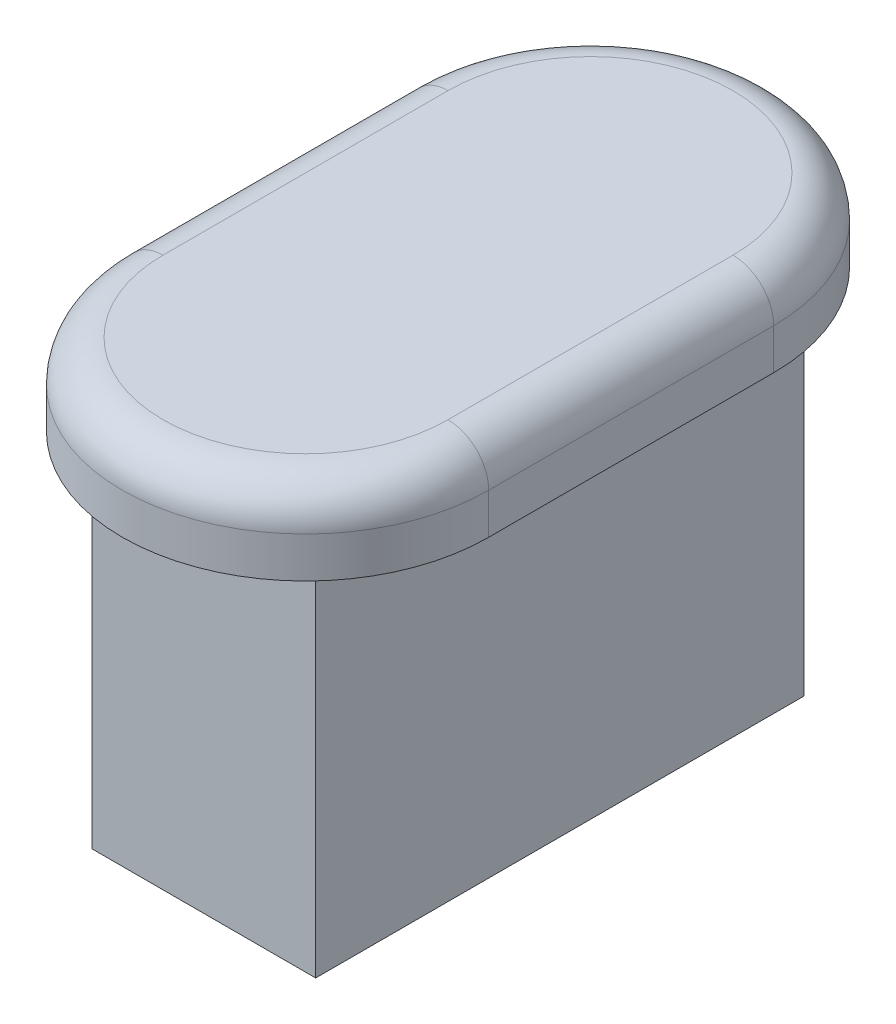
ISO-10303-21;
HEADER;
FILE_DESCRIPTION(('STEP AP214'),'2;1');
FILE_NAME('part.step','',(''),(''),'','','');
FILE_SCHEMA(('AUTOMOTIVE_DESIGN { 1 0 10303 214 1 1 1 1 }'));
ENDSEC;
DATA;
#1=APPLICATION_CONTEXT('core data for automotive mechanical design processes');
#2=APPLICATION_PROTOCOL_DEFINITION('international standard','automotive_design',2000,#1);
#3=PRODUCT_CONTEXT('',#1,'mechanical');
#4=PRODUCT('Part','Part','',(#3));
#5=PRODUCT_RELATED_PRODUCT_CATEGORY('part','',(#4));
#6=PRODUCT_DEFINITION_FORMATION('','',#4);
#7=PRODUCT_DEFINITION_CONTEXT('part definition',#1,'design');
#8=PRODUCT_DEFINITION('design','',#6,#7);
#9=PRODUCT_DEFINITION_SHAPE('','',#8);
#10=(LENGTH_UNIT() NAMED_UNIT(*) SI_UNIT(.MILLI.,.METRE.));
#11=(NAMED_UNIT(*) PLANE_ANGLE_UNIT() SI_UNIT($,.RADIAN.));
#12=(NAMED_UNIT(*) SI_UNIT($,.STERADIAN.) SOLID_ANGLE_UNIT());
#13=UNCERTAINTY_MEASURE_WITH_UNIT(LENGTH_MEASURE(1.E-05),#10,'distance_accuracy_value','');
#14=(GEOMETRIC_REPRESENTATION_CONTEXT(3) GLOBAL_UNCERTAINTY_ASSIGNED_CONTEXT((#13)) GLOBAL_UNIT_ASSIGNED_CONTEXT((#10,
#11,#12)) REPRESENTATION_CONTEXT('',''));
#15=CARTESIAN_POINT('',(0.,0.,0.));
#16=DIRECTION('',(0.,0.,1.));
#17=DIRECTION('',(1.,0.,0.));
#18=AXIS2_PLACEMENT_3D('',#15,#16,#17);
#19=CARTESIAN_POINT('',(-5.60804020100501,9.,-5.90954773869347));
#20=DIRECTION('',(1.,0.,0.));
#21=DIRECTION('',(0.,0.,-1.));
#22=AXIS2_PLACEMENT_3D('',#19,#20,#21);
#23=PLANE('',#22);
#24=DIRECTION('',(0.,0.,1.));
#25=VECTOR('',#24,1.);
#26=CARTESIAN_POINT('',(-5.60804020100501,0.,-5.90954773869347));
#27=LINE('',#26,#25);
#28=CARTESIAN_POINT('',(-5.60804020100501,0.,-5.90954773869347));
#29=VERTEX_POINT('',#28);
#30=CARTESIAN_POINT('',(-5.60804020100501,0.,6.09045226130654));
#31=VERTEX_POINT('',#30);
#32=EDGE_CURVE('E135',#29,#31,#27,.T.);
#33=ORIENTED_EDGE('',*,*,#32,.T.);
#34=DIRECTION('',(0.,-1.,0.));
#35=VECTOR('',#34,1.);
#36=CARTESIAN_POINT('',(-5.60804020100501,9.,6.09045226130654));
#37=LINE('',#36,#35);
#38=CARTESIAN_POINT('',(-5.60804020100501,9.,6.09045226130654));
#39=VERTEX_POINT('',#38);
#40=EDGE_CURVE('E209',#39,#31,#37,.T.);
#41=ORIENTED_EDGE('',*,*,#40,.F.);
#42=DIRECTION('',(0.,0.,1.));
#43=VECTOR('',#42,1.);
#44=CARTESIAN_POINT('',(-5.60804020100501,9.,-5.90954773869347));
#45=LINE('',#44,#43);
#46=CARTESIAN_POINT('',(-5.60804020100501,9.,-5.90954773869347));
#47=VERTEX_POINT('',#46);
#48=EDGE_CURVE('E169',#47,#39,#45,.T.);
#49=ORIENTED_EDGE('',*,*,#48,.F.);
#50=DIRECTION('',(0.,-1.,0.));
#51=VECTOR('',#50,1.);
#52=CARTESIAN_POINT('',(-5.60804020100501,9.,-5.90954773869347));
#53=LINE('',#52,#51);
#54=EDGE_CURVE('E186',#47,#29,#53,.T.);
#55=ORIENTED_EDGE('',*,*,#54,.T.);
#56=EDGE_LOOP('',(#33,#41,#49,#55));
#57=FACE_BOUND('',#56,.T.);
#58=ADVANCED_FACE('F45',(#57),#23,.F.);
#59=CARTESIAN_POINT('',(-5.60804020100501,9.,6.09045226130654));
#60=DIRECTION('',(0.,0.,-1.));
#61=DIRECTION('',(-1.,0.,0.));
#62=AXIS2_PLACEMENT_3D('',#59,#60,#61);
#63=PLANE('',#62);
#64=DIRECTION('',(1.,0.,0.));
#65=VECTOR('',#64,1.);
#66=CARTESIAN_POINT('',(-5.60804020100501,0.,6.09045226130654));
#67=LINE('',#66,#65);
#68=CARTESIAN_POINT('',(-0.108040201005013,0.,6.09045226130654));
#69=VERTEX_POINT('',#68);
#70=EDGE_CURVE('E190',#31,#69,#67,.T.);
#71=ORIENTED_EDGE('',*,*,#70,.T.);
#72=DIRECTION('',(0.,-1.,0.));
#73=VECTOR('',#72,1.);
#74=CARTESIAN_POINT('',(-0.108040201005013,9.,6.09045226130654));
#75=LINE('',#74,#73);
#76=CARTESIAN_POINT('',(-0.108040201005013,9.,6.09045226130654));
#77=VERTEX_POINT('',#76);
#78=EDGE_CURVE('E205',#77,#69,#75,.T.);
#79=ORIENTED_EDGE('',*,*,#78,.F.);
#80=DIRECTION('',(1.,0.,0.));
#81=VECTOR('',#80,1.);
#82=CARTESIAN_POINT('',(-5.60804020100501,9.,6.09045226130654));
#83=LINE('',#82,#81);
#84=EDGE_CURVE('E173',#39,#77,#83,.T.);
#85=ORIENTED_EDGE('',*,*,#84,.F.);
#86=ORIENTED_EDGE('',*,*,#40,.T.);
#87=EDGE_LOOP('',(#71,#79,#85,#86));
#88=FACE_BOUND('',#87,.T.);
#89=ADVANCED_FACE('F266',(#88),#63,.F.);
#90=CARTESIAN_POINT('',(-0.108040201005015,9.,-5.90954773869347));
#91=DIRECTION('',(-1.,0.,0.));
#92=DIRECTION('',(0.,0.,1.));
#93=AXIS2_PLACEMENT_3D('',#90,#91,#92);
#94=PLANE('',#93);
#95=DIRECTION('',(0.,0.,-1.));
#96=VECTOR('',#95,1.);
#97=CARTESIAN_POINT('',(-0.108040201005015,0.,-5.90954773869347));
#98=LINE('',#97,#96);
#99=CARTESIAN_POINT('',(-0.108040201005015,0.,-5.90954773869347));
#100=VERTEX_POINT('',#99);
#101=EDGE_CURVE('E193',#69,#100,#98,.T.);
#102=ORIENTED_EDGE('',*,*,#101,.T.);
#103=DIRECTION('',(0.,-1.,0.));
#104=VECTOR('',#103,1.);
#105=CARTESIAN_POINT('',(-0.108040201005015,9.,-5.90954773869347));
#106=LINE('',#105,#104);
#107=CARTESIAN_POINT('',(-0.108040201005015,9.,-5.90954773869347));
#108=VERTEX_POINT('',#107);
#109=EDGE_CURVE('E201',#108,#100,#106,.T.);
#110=ORIENTED_EDGE('',*,*,#109,.F.);
#111=DIRECTION('',(0.,0.,-1.));
#112=VECTOR('',#111,1.);
#113=CARTESIAN_POINT('',(-0.108040201005015,9.,-5.90954773869347));
#114=LINE('',#113,#112);
#115=EDGE_CURVE('E178',#77,#108,#114,.T.);
#116=ORIENTED_EDGE('',*,*,#115,.F.);
#117=ORIENTED_EDGE('',*,*,#78,.T.);
#118=EDGE_LOOP('',(#102,#110,#116,#117));
#119=FACE_BOUND('',#118,.T.);
#120=ADVANCED_FACE('F273',(#119),#94,.F.);
#121=CARTESIAN_POINT('',(-5.60804020100501,9.,-5.90954773869347));
#122=DIRECTION('',(0.,0.,1.));
#123=DIRECTION('',(1.,0.,0.));
#124=AXIS2_PLACEMENT_3D('',#121,#122,#123);
#125=PLANE('',#124);
#126=DIRECTION('',(-1.,0.,0.));
#127=VECTOR('',#126,1.);
#128=CARTESIAN_POINT('',(-5.60804020100501,0.,-5.90954773869347));
#129=LINE('',#128,#127);
#130=EDGE_CURVE('E174',#100,#29,#129,.T.);
#131=ORIENTED_EDGE('',*,*,#130,.T.);
#132=ORIENTED_EDGE('',*,*,#54,.F.);
#133=DIRECTION('',(-1.,0.,0.));
#134=VECTOR('',#133,1.);
#135=CARTESIAN_POINT('',(-5.60804020100501,9.,-5.90954773869347));
#136=LINE('',#135,#134);
#137=EDGE_CURVE('E182',#108,#47,#136,.T.);
#138=ORIENTED_EDGE('',*,*,#137,.F.);
#139=ORIENTED_EDGE('',*,*,#109,.T.);
#140=EDGE_LOOP('',(#131,#132,#138,#139));
#141=FACE_BOUND('',#140,.T.);
#142=ADVANCED_FACE('F301',(#141),#125,.F.);
#143=CARTESIAN_POINT('',(0.,0.,0.));
#144=DIRECTION('',(0.,1.,0.));
#145=DIRECTION('',(0.,0.,1.));
#146=AXIS2_PLACEMENT_3D('',#143,#144,#145);
#147=PLANE('',#146);
#148=ORIENTED_EDGE('',*,*,#32,.F.);
#149=ORIENTED_EDGE('',*,*,#130,.F.);
#150=ORIENTED_EDGE('',*,*,#101,.F.);
#151=ORIENTED_EDGE('',*,*,#70,.F.);
#152=EDGE_LOOP('',(#148,#149,#150,#151));
#153=FACE_BOUND('',#152,.T.);
#154=ADVANCED_FACE('F295',(#153),#147,.F.);
#155=CARTESIAN_POINT('',(-2.85804020100501,9.,-3.40954773869347));
#156=DIRECTION('',(0.,1.,0.));
#157=DIRECTION('',(0.,0.,1.));
#158=AXIS2_PLACEMENT_3D('',#155,#156,#157);
#159=PLANE('',#158);
#160=CARTESIAN_POINT('',(-2.85804020100501,9.,-3.40954773869347));
#161=DIRECTION('',(0.,1.,0.));
#162=DIRECTION('',(0.,0.,1.));
#163=AXIS2_PLACEMENT_3D('',#160,#161,#162);
#164=CIRCLE('',#163,4.5);
#165=CARTESIAN_POINT('',(1.64195979899498,9.,-3.40954773869347));
#166=VERTEX_POINT('',#165);
#167=CARTESIAN_POINT('',(-7.35804020100501,9.,-3.40954773869347));
#168=VERTEX_POINT('',#167);
#169=EDGE_CURVE('E143',#166,#168,#164,.T.);
#170=ORIENTED_EDGE('',*,*,#169,.F.);
#171=DIRECTION('',(0.,0.,-1.));
#172=VECTOR('',#171,1.);
#173=CARTESIAN_POINT('',(1.64195979899498,9.,-3.40954773869347));
#174=LINE('',#173,#172);
#175=CARTESIAN_POINT('',(1.64195979899498,9.,3.59045226130653));
#176=VERTEX_POINT('',#175);
#177=EDGE_CURVE('E159',#176,#166,#174,.T.);
#178=ORIENTED_EDGE('',*,*,#177,.F.);
#179=CARTESIAN_POINT('',(-2.85804020100501,9.,3.59045226130654));
#180=DIRECTION('',(0.,1.,0.));
#181=DIRECTION('',(0.,0.,1.));
#182=AXIS2_PLACEMENT_3D('',#179,#180,#181);
#183=CIRCLE('',#182,4.5);
#184=CARTESIAN_POINT('',(-7.35804020100501,9.,3.59045226130653));
#185=VERTEX_POINT('',#184);
#186=EDGE_CURVE('E145',#185,#176,#183,.T.);
#187=ORIENTED_EDGE('',*,*,#186,.F.);
#188=DIRECTION('',(0.,0.,1.));
#189=VECTOR('',#188,1.);
#190=CARTESIAN_POINT('',(-7.35804020100501,9.,-3.40954773869347));
#191=LINE('',#190,#189);
#192=EDGE_CURVE('E127',#168,#185,#191,.T.);
#193=ORIENTED_EDGE('',*,*,#192,.F.);
#194=EDGE_LOOP('',(#170,#178,#187,#193));
#195=FACE_BOUND('',#194,.T.);
#196=ORIENTED_EDGE('',*,*,#137,.T.);
#197=ORIENTED_EDGE('',*,*,#48,.T.);
#198=ORIENTED_EDGE('',*,*,#84,.T.);
#199=ORIENTED_EDGE('',*,*,#115,.T.);
#200=EDGE_LOOP('',(#196,#197,#198,#199));
#201=FACE_BOUND('',#200,.T.);
#202=ADVANCED_FACE('F140',(#195,#201),#159,.F.);
#203=CARTESIAN_POINT('',(-2.85804020100501,11.,-3.40954773869347));
#204=DIRECTION('',(0.,-1.,0.));
#205=DIRECTION('',(0.,0.,-1.));
#206=AXIS2_PLACEMENT_3D('',#203,#204,#205);
#207=CYLINDRICAL_SURFACE('',#206,4.5);
#208=DIRECTION('',(0.,-1.,0.));
#209=VECTOR('',#208,1.);
#210=CARTESIAN_POINT('',(-7.35804020100501,11.,-3.40954773869347));
#211=LINE('',#210,#209);
#212=CARTESIAN_POINT('',(-7.35804020100501,10.,-3.40954773869347));
#213=VERTEX_POINT('',#212);
#214=EDGE_CURVE('E124',#213,#168,#211,.T.);
#215=ORIENTED_EDGE('',*,*,#214,.F.);
#216=CARTESIAN_POINT('',(-2.85804020100501,10.,-3.40954773869347));
#217=DIRECTION('',(0.,1.,0.));
#218=DIRECTION('',(0.,0.,1.));
#219=AXIS2_PLACEMENT_3D('',#216,#217,#218);
#220=CIRCLE('',#219,4.5);
#221=CARTESIAN_POINT('',(1.64195979899498,10.,-3.40954773869347));
#222=VERTEX_POINT('',#221);
#223=EDGE_CURVE('E226',#213,#222,#220,.F.);
#224=ORIENTED_EDGE('',*,*,#223,.T.);
#225=DIRECTION('',(0.,-1.,0.));
#226=VECTOR('',#225,1.);
#227=CARTESIAN_POINT('',(1.64195979899498,11.,-3.40954773869347));
#228=LINE('',#227,#226);
#229=EDGE_CURVE('E149',#222,#166,#228,.T.);
#230=ORIENTED_EDGE('',*,*,#229,.T.);
#231=ORIENTED_EDGE('',*,*,#169,.T.);
#232=EDGE_LOOP('',(#215,#224,#230,#231));
#233=FACE_BOUND('',#232,.T.);
#234=ADVANCED_FACE('F148',(#233),#207,.T.);
#235=CARTESIAN_POINT('',(-7.35804020100501,11.,-3.40954773869347));
#236=DIRECTION('',(1.,0.,0.));
#237=DIRECTION('',(0.,0.,-1.));
#238=AXIS2_PLACEMENT_3D('',#235,#236,#237);
#239=PLANE('',#238);
#240=DIRECTION('',(0.,-1.,0.));
#241=VECTOR('',#240,1.);
#242=CARTESIAN_POINT('',(-7.35804020100501,11.,3.59045226130653));
#243=LINE('',#242,#241);
#244=CARTESIAN_POINT('',(-7.35804020100501,10.,3.59045226130653));
#245=VERTEX_POINT('',#244);
#246=EDGE_CURVE('E136',#245,#185,#243,.T.);
#247=ORIENTED_EDGE('',*,*,#246,.F.);
#248=DIRECTION('',(0.,0.,1.));
#249=VECTOR('',#248,1.);
#250=CARTESIAN_POINT('',(-7.35804020100501,10.,-3.40954773869347));
#251=LINE('',#250,#249);
#252=EDGE_CURVE('E11',#245,#213,#251,.F.);
#253=ORIENTED_EDGE('',*,*,#252,.T.);
#254=ORIENTED_EDGE('',*,*,#214,.T.);
#255=ORIENTED_EDGE('',*,*,#192,.T.);
#256=EDGE_LOOP('',(#247,#253,#254,#255));
#257=FACE_BOUND('',#256,.T.);
#258=ADVANCED_FACE('F126',(#257),#239,.F.);
#259=CARTESIAN_POINT('',(-2.85804020100501,11.,3.59045226130654));
#260=DIRECTION('',(0.,-1.,0.));
#261=DIRECTION('',(0.,0.,-1.));
#262=AXIS2_PLACEMENT_3D('',#259,#260,#261);
#263=CYLINDRICAL_SURFACE('',#262,4.5);
#264=DIRECTION('',(0.,-1.,0.));
#265=VECTOR('',#264,1.);
#266=CARTESIAN_POINT('',(1.64195979899498,11.,3.59045226130653));
#267=LINE('',#266,#265);
#268=CARTESIAN_POINT('',(1.64195979899498,10.,3.59045226130653));
#269=VERTEX_POINT('',#268);
#270=EDGE_CURVE('E164',#269,#176,#267,.T.);
#271=ORIENTED_EDGE('',*,*,#270,.F.);
#272=CARTESIAN_POINT('',(-2.85804020100501,10.,3.59045226130654));
#273=DIRECTION('',(0.,1.,0.));
#274=DIRECTION('',(0.,0.,1.));
#275=AXIS2_PLACEMENT_3D('',#272,#273,#274);
#276=CIRCLE('',#275,4.5);
#277=EDGE_CURVE('E55',#269,#245,#276,.F.);
#278=ORIENTED_EDGE('',*,*,#277,.T.);
#279=ORIENTED_EDGE('',*,*,#246,.T.);
#280=ORIENTED_EDGE('',*,*,#186,.T.);
#281=EDGE_LOOP('',(#271,#278,#279,#280));
#282=FACE_BOUND('',#281,.T.);
#283=ADVANCED_FACE('F256',(#282),#263,.T.);
#284=CARTESIAN_POINT('',(1.64195979899498,11.,-3.40954773869347));
#285=DIRECTION('',(-1.,0.,0.));
#286=DIRECTION('',(0.,0.,1.));
#287=AXIS2_PLACEMENT_3D('',#284,#285,#286);
#288=PLANE('',#287);
#289=ORIENTED_EDGE('',*,*,#229,.F.);
#290=DIRECTION('',(0.,0.,-1.));
#291=VECTOR('',#290,1.);
#292=CARTESIAN_POINT('',(1.64195979899498,10.,3.59045226130653));
#293=LINE('',#292,#291);
#294=EDGE_CURVE('E70',#222,#269,#293,.F.);
#295=ORIENTED_EDGE('',*,*,#294,.T.);
#296=ORIENTED_EDGE('',*,*,#270,.T.);
#297=ORIENTED_EDGE('',*,*,#177,.T.);
#298=EDGE_LOOP('',(#289,#295,#296,#297));
#299=FACE_BOUND('',#298,.T.);
#300=ADVANCED_FACE('F255',(#299),#288,.F.);
#301=CARTESIAN_POINT('',(-2.85804020100501,11.,-3.40954773869347));
#302=DIRECTION('',(0.,1.,0.));
#303=DIRECTION('',(0.,0.,1.));
#304=AXIS2_PLACEMENT_3D('',#301,#302,#303);
#305=PLANE('',#304);
#306=DIRECTION('',(0.,0.,-1.));
#307=VECTOR('',#306,1.);
#308=CARTESIAN_POINT('',(0.641959798994984,11.,-3.40954773869347));
#309=LINE('',#308,#307);
#310=CARTESIAN_POINT('',(0.641959798994986,11.,3.59045226130653));
#311=VERTEX_POINT('',#310);
#312=CARTESIAN_POINT('',(0.641959798994984,11.,-3.40954773869347));
#313=VERTEX_POINT('',#312);
#314=EDGE_CURVE('E219',#311,#313,#309,.T.);
#315=ORIENTED_EDGE('',*,*,#314,.T.);
#316=CARTESIAN_POINT('',(-2.85804020100501,11.,-3.40954773869347));
#317=DIRECTION('',(0.,1.,0.));
#318=DIRECTION('',(0.,0.,1.));
#319=AXIS2_PLACEMENT_3D('',#316,#317,#318);
#320=CIRCLE('',#319,3.5);
#321=CARTESIAN_POINT('',(-6.35804020100501,11.,-3.40954773869347));
#322=VERTEX_POINT('',#321);
#323=EDGE_CURVE('E222',#313,#322,#320,.T.);
#324=ORIENTED_EDGE('',*,*,#323,.T.);
#325=DIRECTION('',(0.,0.,1.));
#326=VECTOR('',#325,1.);
#327=CARTESIAN_POINT('',(-6.35804020100501,11.,3.59045226130653));
#328=LINE('',#327,#326);
#329=CARTESIAN_POINT('',(-6.35804020100501,11.,3.59045226130653));
#330=VERTEX_POINT('',#329);
#331=EDGE_CURVE('E213',#322,#330,#328,.T.);
#332=ORIENTED_EDGE('',*,*,#331,.T.);
#333=CARTESIAN_POINT('',(-2.85804020100501,11.,3.59045226130654));
#334=DIRECTION('',(0.,1.,0.));
#335=DIRECTION('',(0.,0.,1.));
#336=AXIS2_PLACEMENT_3D('',#333,#334,#335);
#337=CIRCLE('',#336,3.5);
#338=EDGE_CURVE('E216',#330,#311,#337,.T.);
#339=ORIENTED_EDGE('',*,*,#338,.T.);
#340=EDGE_LOOP('',(#315,#324,#332,#339));
#341=FACE_BOUND('',#340,.T.);
#342=ADVANCED_FACE('F250',(#341),#305,.T.);
#343=CARTESIAN_POINT('',(-2.85804020100501,10.,3.59045226130654));
#344=DIRECTION('',(0.,1.,0.));
#345=DIRECTION('',(0.,0.,1.));
#346=AXIS2_PLACEMENT_3D('',#343,#344,#345);
#347=TOROIDAL_SURFACE('',#346,3.5,1.);
#348=CARTESIAN_POINT('',(-6.35804020100501,10.,3.59045226130653));
#349=DIRECTION('',(0.,0.,-1.));
#350=DIRECTION('',(-1.,0.,0.));
#351=AXIS2_PLACEMENT_3D('',#348,#349,#350);
#352=CIRCLE('',#351,1.);
#353=EDGE_CURVE('E155',#245,#330,#352,.T.);
#354=ORIENTED_EDGE('',*,*,#353,.F.);
#355=ORIENTED_EDGE('',*,*,#277,.F.);
#356=CARTESIAN_POINT('',(0.641959798994986,10.,3.59045226130653));
#357=DIRECTION('',(0.,0.,-1.));
#358=DIRECTION('',(-1.,0.,0.));
#359=AXIS2_PLACEMENT_3D('',#356,#357,#358);
#360=CIRCLE('',#359,1.);
#361=EDGE_CURVE('E49',#311,#269,#360,.T.);
#362=ORIENTED_EDGE('',*,*,#361,.F.);
#363=ORIENTED_EDGE('',*,*,#338,.F.);
#364=EDGE_LOOP('',(#354,#355,#362,#363));
#365=FACE_BOUND('',#364,.T.);
#366=ADVANCED_FACE('F47',(#365),#347,.T.);
#367=CARTESIAN_POINT('',(0.641959798994984,10.,-3.40954773869347));
#368=DIRECTION('',(0.,0.,1.));
#369=DIRECTION('',(1.,0.,0.));
#370=AXIS2_PLACEMENT_3D('',#367,#368,#369);
#371=CYLINDRICAL_SURFACE('',#370,1.);
#372=ORIENTED_EDGE('',*,*,#361,.T.);
#373=ORIENTED_EDGE('',*,*,#294,.F.);
#374=CARTESIAN_POINT('',(0.641959798994984,10.,-3.40954773869347));
#375=DIRECTION('',(0.,0.,-1.));
#376=DIRECTION('',(-1.,0.,0.));
#377=AXIS2_PLACEMENT_3D('',#374,#375,#376);
#378=CIRCLE('',#377,1.);
#379=EDGE_CURVE('E236',#313,#222,#378,.T.);
#380=ORIENTED_EDGE('',*,*,#379,.F.);
#381=ORIENTED_EDGE('',*,*,#314,.F.);
#382=EDGE_LOOP('',(#372,#373,#380,#381));
#383=FACE_BOUND('',#382,.T.);
#384=ADVANCED_FACE('F281',(#383),#371,.T.);
#385=CARTESIAN_POINT('',(-6.35804020100501,10.,-3.40954773869347));
#386=DIRECTION('',(0.,0.,-1.));
#387=DIRECTION('',(-1.,0.,0.));
#388=AXIS2_PLACEMENT_3D('',#385,#386,#387);
#389=CYLINDRICAL_SURFACE('',#388,1.);
#390=ORIENTED_EDGE('',*,*,#353,.T.);
#391=ORIENTED_EDGE('',*,*,#331,.F.);
#392=CARTESIAN_POINT('',(-6.35804020100501,10.,-3.40954773869347));
#393=DIRECTION('',(0.,0.,-1.));
#394=DIRECTION('',(-1.,0.,0.));
#395=AXIS2_PLACEMENT_3D('',#392,#393,#394);
#396=CIRCLE('',#395,1.);
#397=EDGE_CURVE('E233',#213,#322,#396,.T.);
#398=ORIENTED_EDGE('',*,*,#397,.F.);
#399=ORIENTED_EDGE('',*,*,#252,.F.);
#400=EDGE_LOOP('',(#390,#391,#398,#399));
#401=FACE_BOUND('',#400,.T.);
#402=ADVANCED_FACE('F243',(#401),#389,.T.);
#403=CARTESIAN_POINT('',(-2.85804020100501,10.,-3.40954773869347));
#404=DIRECTION('',(0.,1.,0.));
#405=DIRECTION('',(0.,0.,1.));
#406=AXIS2_PLACEMENT_3D('',#403,#404,#405);
#407=TOROIDAL_SURFACE('',#406,3.5,1.);
#408=ORIENTED_EDGE('',*,*,#379,.T.);
#409=ORIENTED_EDGE('',*,*,#223,.F.);
#410=ORIENTED_EDGE('',*,*,#397,.T.);
#411=ORIENTED_EDGE('',*,*,#323,.F.);
#412=EDGE_LOOP('',(#408,#409,#410,#411));
#413=FACE_BOUND('',#412,.T.);
#414=ADVANCED_FACE('F254',(#413),#407,.T.);
#415=CLOSED_SHELL('',(#58,#89,#120,#142,#154,#202,#234,#258,#283,#300,#342,#366,#384,#402,#414));
#416=MANIFOLD_SOLID_BREP('B2',#415);
#417=ADVANCED_BREP_SHAPE_REPRESENTATION('',(#18,#416),#14);
#418=SHAPE_DEFINITION_REPRESENTATION(#9,#417);
ENDSEC;
END-ISO-10303-21;
